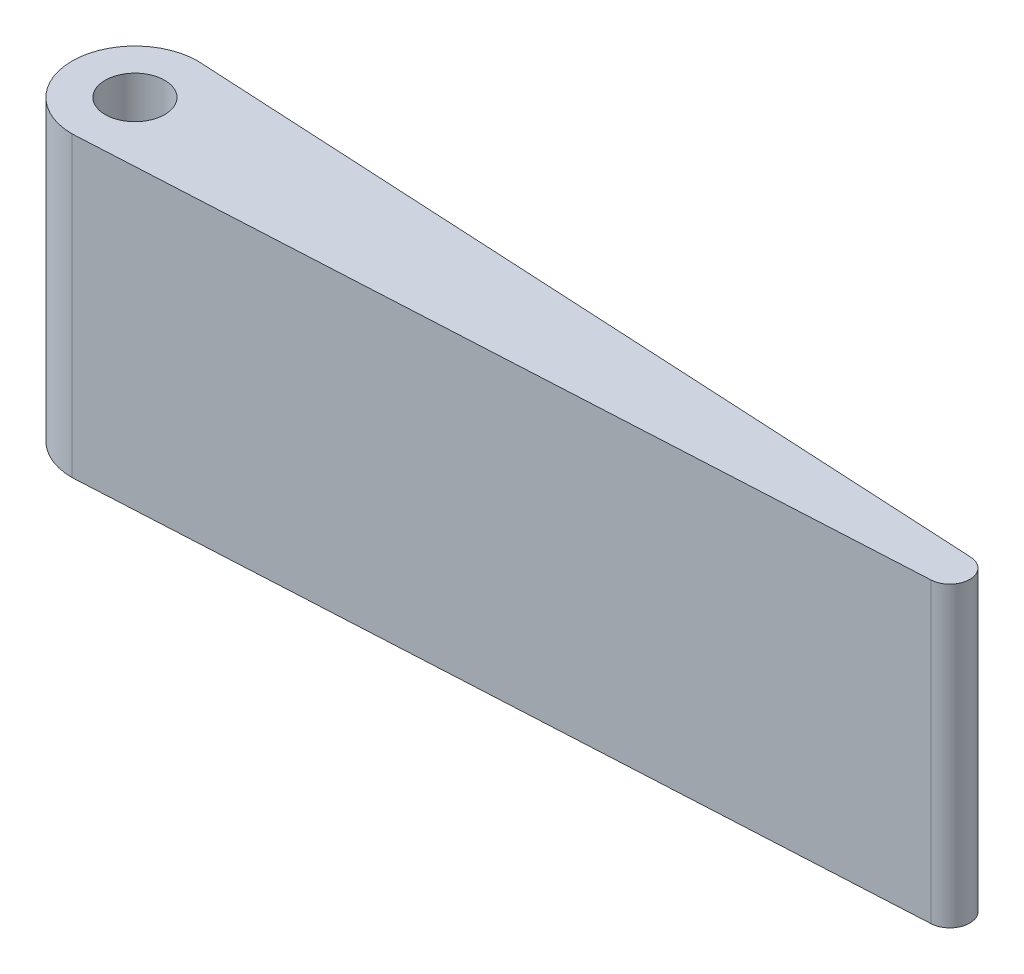
ISO-10303-21;
HEADER;
FILE_DESCRIPTION(('STEP AP214'),'2;1');
FILE_NAME('part.step','',(''),(''),'','','');
FILE_SCHEMA(('AUTOMOTIVE_DESIGN { 1 0 10303 214 1 1 1 1 }'));
ENDSEC;
DATA;
#1=APPLICATION_CONTEXT('core data for automotive mechanical design processes');
#2=APPLICATION_PROTOCOL_DEFINITION('international standard','automotive_design',2000,#1);
#3=PRODUCT_CONTEXT('',#1,'mechanical');
#4=PRODUCT('Part','Part','',(#3));
#5=PRODUCT_RELATED_PRODUCT_CATEGORY('part','',(#4));
#6=PRODUCT_DEFINITION_FORMATION('','',#4);
#7=PRODUCT_DEFINITION_CONTEXT('part definition',#1,'design');
#8=PRODUCT_DEFINITION('design','',#6,#7);
#9=PRODUCT_DEFINITION_SHAPE('','',#8);
#10=(LENGTH_UNIT() NAMED_UNIT(*) SI_UNIT(.MILLI.,.METRE.));
#11=(NAMED_UNIT(*) PLANE_ANGLE_UNIT() SI_UNIT($,.RADIAN.));
#12=(NAMED_UNIT(*) SI_UNIT($,.STERADIAN.) SOLID_ANGLE_UNIT());
#13=UNCERTAINTY_MEASURE_WITH_UNIT(LENGTH_MEASURE(1.E-05),#10,'distance_accuracy_value','');
#14=(GEOMETRIC_REPRESENTATION_CONTEXT(3) GLOBAL_UNCERTAINTY_ASSIGNED_CONTEXT((#13)) GLOBAL_UNIT_ASSIGNED_CONTEXT((#10,
#11,#12)) REPRESENTATION_CONTEXT('',''));
#15=CARTESIAN_POINT('',(0.,0.,0.));
#16=DIRECTION('',(0.,0.,1.));
#17=DIRECTION('',(1.,0.,0.));
#18=AXIS2_PLACEMENT_3D('',#15,#16,#17);
#19=CARTESIAN_POINT('',(0.,30.,0.));
#20=DIRECTION('',(0.,1.,0.));
#21=DIRECTION('',(0.,0.,1.));
#22=AXIS2_PLACEMENT_3D('',#19,#20,#21);
#23=PLANE('',#22);
#24=DIRECTION('',(0.998603825363666,0.,-0.052824236568573));
#25=VECTOR('',#24,1.);
#26=CARTESIAN_POINT('',(120.,30.,0.));
#27=LINE('',#26,#25);
#28=CARTESIAN_POINT('',(0.0162098052131259,30.,6.34691351731533));
#29=VERTEX_POINT('',#28);
#30=CARTESIAN_POINT('',(82.2391398476669,30.,1.99747743705391));
#31=VERTEX_POINT('',#30);
#32=EDGE_CURVE('E97',#29,#31,#27,.T.);
#33=ORIENTED_EDGE('',*,*,#32,.T.);
#34=CARTESIAN_POINT('',(82.1334913745297,30.,0.000269786326582196));
#35=DIRECTION('',(0.,1.,0.));
#36=DIRECTION('',(0.,0.,1.));
#37=AXIS2_PLACEMENT_3D('',#34,#35,#36);
#38=CIRCLE('',#37,2.);
#39=CARTESIAN_POINT('',(82.2391113887707,30.,-1.99693936961872));
#40=VERTEX_POINT('',#39);
#41=EDGE_CURVE('E11',#31,#40,#38,.T.);
#42=ORIENTED_EDGE('',*,*,#41,.T.);
#43=DIRECTION('',(-0.99860457797265,0.,-0.0528100071204905));
#44=VECTOR('',#43,1.);
#45=CARTESIAN_POINT('',(120.,30.,0.));
#46=LINE('',#45,#44);
#47=CARTESIAN_POINT('',(-0.016209805213125,30.,-6.34691351731533));
#48=VERTEX_POINT('',#47);
#49=EDGE_CURVE('E86',#40,#48,#46,.T.);
#50=ORIENTED_EDGE('',*,*,#49,.T.);
#51=CARTESIAN_POINT('',(0.,30.,0.));
#52=DIRECTION('',(0.,1.,0.));
#53=DIRECTION('',(0.,0.,1.));
#54=AXIS2_PLACEMENT_3D('',#51,#52,#53);
#55=CIRCLE('',#54,6.34693421693223);
#56=EDGE_CURVE('E90',#48,#29,#55,.T.);
#57=ORIENTED_EDGE('',*,*,#56,.T.);
#58=EDGE_LOOP('',(#33,#42,#50,#57));
#59=FACE_BOUND('',#58,.T.);
#60=CARTESIAN_POINT('',(0.,30.,0.));
#61=DIRECTION('',(0.,1.,0.));
#62=DIRECTION('',(0.,0.,1.));
#63=AXIS2_PLACEMENT_3D('',#60,#61,#62);
#64=CIRCLE('',#63,3.);
#65=CARTESIAN_POINT('',(0.,30.,3.));
#66=VERTEX_POINT('',#65);
#67=EDGE_CURVE('E120',#66,#66,#64,.T.);
#68=ORIENTED_EDGE('',*,*,#67,.F.);
#69=EDGE_LOOP('',(#68));
#70=FACE_BOUND('',#69,.T.);
#71=ADVANCED_FACE('F45',(#59,#70),#23,.T.);
#72=CARTESIAN_POINT('',(0.,0.,0.));
#73=DIRECTION('',(0.,1.,0.));
#74=DIRECTION('',(0.,0.,1.));
#75=AXIS2_PLACEMENT_3D('',#72,#73,#74);
#76=PLANE('',#75);
#77=DIRECTION('',(-0.99860457797265,0.,-0.0528100071204905));
#78=VECTOR('',#77,1.);
#79=CARTESIAN_POINT('',(120.,0.,0.));
#80=LINE('',#79,#78);
#81=CARTESIAN_POINT('',(82.2391113887707,0.,-1.99693936961872));
#82=VERTEX_POINT('',#81);
#83=CARTESIAN_POINT('',(-0.016209805213125,0.,-6.34691351731533));
#84=VERTEX_POINT('',#83);
#85=EDGE_CURVE('E102',#82,#84,#80,.T.);
#86=ORIENTED_EDGE('',*,*,#85,.F.);
#87=CARTESIAN_POINT('',(82.1334913745297,0.,0.000269786326582196));
#88=DIRECTION('',(0.,1.,0.));
#89=DIRECTION('',(0.,0.,1.));
#90=AXIS2_PLACEMENT_3D('',#87,#88,#89);
#91=CIRCLE('',#90,2.);
#92=CARTESIAN_POINT('',(82.2391398476669,0.,1.99747743705391));
#93=VERTEX_POINT('',#92);
#94=EDGE_CURVE('E68',#82,#93,#91,.F.);
#95=ORIENTED_EDGE('',*,*,#94,.T.);
#96=DIRECTION('',(0.998603825363666,0.,-0.052824236568573));
#97=VECTOR('',#96,1.);
#98=CARTESIAN_POINT('',(120.,0.,0.));
#99=LINE('',#98,#97);
#100=CARTESIAN_POINT('',(0.0162098052131259,0.,6.34691351731533));
#101=VERTEX_POINT('',#100);
#102=EDGE_CURVE('E117',#101,#93,#99,.T.);
#103=ORIENTED_EDGE('',*,*,#102,.F.);
#104=CARTESIAN_POINT('',(0.,0.,0.));
#105=DIRECTION('',(0.,1.,0.));
#106=DIRECTION('',(0.,0.,1.));
#107=AXIS2_PLACEMENT_3D('',#104,#105,#106);
#108=CIRCLE('',#107,6.34693421693223);
#109=EDGE_CURVE('E123',#84,#101,#108,.T.);
#110=ORIENTED_EDGE('',*,*,#109,.F.);
#111=EDGE_LOOP('',(#86,#95,#103,#110));
#112=FACE_BOUND('',#111,.T.);
#113=CARTESIAN_POINT('',(0.,0.,0.));
#114=DIRECTION('',(0.,1.,0.));
#115=DIRECTION('',(0.,0.,1.));
#116=AXIS2_PLACEMENT_3D('',#113,#114,#115);
#117=CIRCLE('',#116,3.);
#118=CARTESIAN_POINT('',(0.,0.,3.));
#119=VERTEX_POINT('',#118);
#120=EDGE_CURVE('E136',#119,#119,#117,.T.);
#121=ORIENTED_EDGE('',*,*,#120,.T.);
#122=EDGE_LOOP('',(#121));
#123=FACE_BOUND('',#122,.T.);
#124=ADVANCED_FACE('F131',(#112,#123),#76,.F.);
#125=CARTESIAN_POINT('',(120.,30.,0.));
#126=DIRECTION('',(-0.052824236568573,0.,-0.998603825363666));
#127=DIRECTION('',(-0.998603825363666,0.,0.052824236568573));
#128=AXIS2_PLACEMENT_3D('',#125,#126,#127);
#129=PLANE('',#128);
#130=ORIENTED_EDGE('',*,*,#102,.T.);
#131=DIRECTION('',(0.,-1.,0.));
#132=VECTOR('',#131,1.);
#133=CARTESIAN_POINT('',(82.2391398476668,30.,1.99747743705391));
#134=LINE('',#133,#132);
#135=EDGE_CURVE('E54',#93,#31,#134,.F.);
#136=ORIENTED_EDGE('',*,*,#135,.T.);
#137=ORIENTED_EDGE('',*,*,#32,.F.);
#138=DIRECTION('',(0.,-1.,0.));
#139=VECTOR('',#138,1.);
#140=CARTESIAN_POINT('',(0.0162098052131259,30.,6.34691351731533));
#141=LINE('',#140,#139);
#142=EDGE_CURVE('E107',#29,#101,#141,.T.);
#143=ORIENTED_EDGE('',*,*,#142,.T.);
#144=EDGE_LOOP('',(#130,#136,#137,#143));
#145=FACE_BOUND('',#144,.T.);
#146=ADVANCED_FACE('F133',(#145),#129,.F.);
#147=CARTESIAN_POINT('',(120.,30.,0.));
#148=DIRECTION('',(-0.0528100071204905,0.,0.99860457797265));
#149=DIRECTION('',(0.99860457797265,0.,0.0528100071204905));
#150=AXIS2_PLACEMENT_3D('',#147,#148,#149);
#151=PLANE('',#150);
#152=ORIENTED_EDGE('',*,*,#49,.F.);
#153=DIRECTION('',(0.,-1.,0.));
#154=VECTOR('',#153,1.);
#155=CARTESIAN_POINT('',(82.2391113887707,30.,-1.99693936961872));
#156=LINE('',#155,#154);
#157=EDGE_CURVE('E106',#40,#82,#156,.T.);
#158=ORIENTED_EDGE('',*,*,#157,.T.);
#159=ORIENTED_EDGE('',*,*,#85,.T.);
#160=DIRECTION('',(0.,-1.,0.));
#161=VECTOR('',#160,1.);
#162=CARTESIAN_POINT('',(-0.016209805213125,30.,-6.34691351731533));
#163=LINE('',#162,#161);
#164=EDGE_CURVE('E100',#48,#84,#163,.T.);
#165=ORIENTED_EDGE('',*,*,#164,.F.);
#166=EDGE_LOOP('',(#152,#158,#159,#165));
#167=FACE_BOUND('',#166,.T.);
#168=ADVANCED_FACE('F101',(#167),#151,.F.);
#169=CARTESIAN_POINT('',(0.,30.,0.));
#170=DIRECTION('',(0.,-1.,0.));
#171=DIRECTION('',(0.,0.,-1.));
#172=AXIS2_PLACEMENT_3D('',#169,#170,#171);
#173=CYLINDRICAL_SURFACE('',#172,6.34693421693223);
#174=ORIENTED_EDGE('',*,*,#109,.T.);
#175=ORIENTED_EDGE('',*,*,#142,.F.);
#176=ORIENTED_EDGE('',*,*,#56,.F.);
#177=ORIENTED_EDGE('',*,*,#164,.T.);
#178=EDGE_LOOP('',(#174,#175,#176,#177));
#179=FACE_BOUND('',#178,.T.);
#180=ADVANCED_FACE('F109',(#179),#173,.T.);
#181=CARTESIAN_POINT('',(0.,30.,0.));
#182=DIRECTION('',(0.,-1.,0.));
#183=DIRECTION('',(0.,0.,-1.));
#184=AXIS2_PLACEMENT_3D('',#181,#182,#183);
#185=CYLINDRICAL_SURFACE('',#184,3.);
#186=ORIENTED_EDGE('',*,*,#67,.T.);
#187=EDGE_LOOP('',(#186));
#188=FACE_BOUND('',#187,.T.);
#189=ORIENTED_EDGE('',*,*,#120,.F.);
#190=EDGE_LOOP('',(#189));
#191=FACE_BOUND('',#190,.T.);
#192=ADVANCED_FACE('F144',(#188,#191),#185,.F.);
#193=CARTESIAN_POINT('',(82.1334913745297,30.,0.000269786326582196));
#194=DIRECTION('',(0.,-1.,0.));
#195=DIRECTION('',(0.,0.,-1.));
#196=AXIS2_PLACEMENT_3D('',#193,#194,#195);
#197=CYLINDRICAL_SURFACE('',#196,2.);
#198=ORIENTED_EDGE('',*,*,#41,.F.);
#199=ORIENTED_EDGE('',*,*,#135,.F.);
#200=ORIENTED_EDGE('',*,*,#94,.F.);
#201=ORIENTED_EDGE('',*,*,#157,.F.);
#202=EDGE_LOOP('',(#198,#199,#200,#201));
#203=FACE_BOUND('',#202,.T.);
#204=ADVANCED_FACE('F47',(#203),#197,.T.);
#205=CLOSED_SHELL('',(#71,#124,#146,#168,#180,#192,#204));
#206=MANIFOLD_SOLID_BREP('B2',#205);
#207=ADVANCED_BREP_SHAPE_REPRESENTATION('',(#18,#206),#14);
#208=SHAPE_DEFINITION_REPRESENTATION(#9,#207);
ENDSEC;
END-ISO-10303-21;
